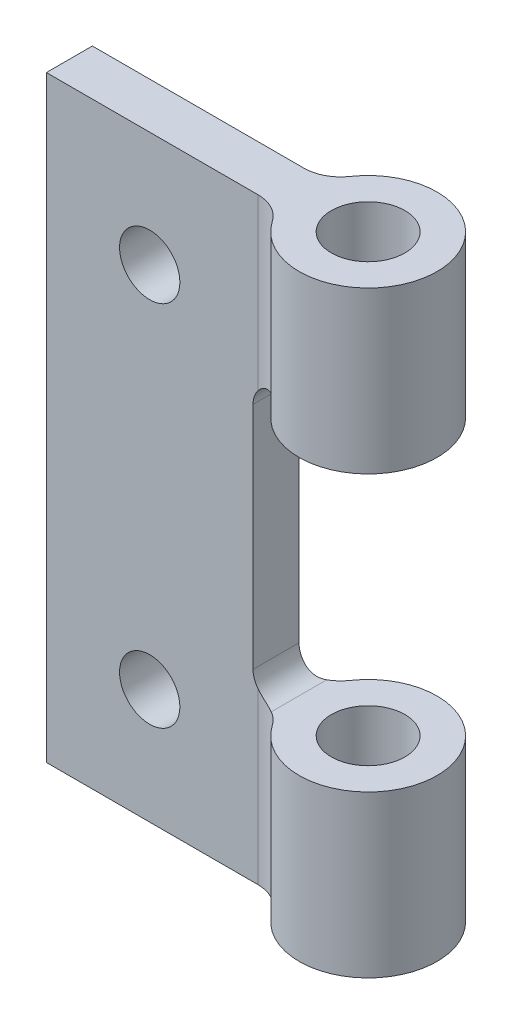
ISO-10303-21;
HEADER;
FILE_DESCRIPTION(('STEP AP214'),'2;1');
FILE_NAME('part.step','',(''),(''),'','','');
FILE_SCHEMA(('AUTOMOTIVE_DESIGN { 1 0 10303 214 1 1 1 1 }'));
ENDSEC;
DATA;
#1=APPLICATION_CONTEXT('core data for automotive mechanical design processes');
#2=APPLICATION_PROTOCOL_DEFINITION('international standard','automotive_design',2000,#1);
#3=PRODUCT_CONTEXT('',#1,'mechanical');
#4=PRODUCT('Part','Part','',(#3));
#5=PRODUCT_RELATED_PRODUCT_CATEGORY('part','',(#4));
#6=PRODUCT_DEFINITION_FORMATION('','',#4);
#7=PRODUCT_DEFINITION_CONTEXT('part definition',#1,'design');
#8=PRODUCT_DEFINITION('design','',#6,#7);
#9=PRODUCT_DEFINITION_SHAPE('','',#8);
#10=(LENGTH_UNIT() NAMED_UNIT(*) SI_UNIT(.MILLI.,.METRE.));
#11=(NAMED_UNIT(*) PLANE_ANGLE_UNIT() SI_UNIT($,.RADIAN.));
#12=(NAMED_UNIT(*) SI_UNIT($,.STERADIAN.) SOLID_ANGLE_UNIT());
#13=UNCERTAINTY_MEASURE_WITH_UNIT(LENGTH_MEASURE(1.E-05),#10,'distance_accuracy_value','');
#14=(GEOMETRIC_REPRESENTATION_CONTEXT(3) GLOBAL_UNCERTAINTY_ASSIGNED_CONTEXT((#13)) GLOBAL_UNIT_ASSIGNED_CONTEXT((#10,
#11,#12)) REPRESENTATION_CONTEXT('',''));
#15=CARTESIAN_POINT('',(0.,0.,0.));
#16=DIRECTION('',(0.,0.,1.));
#17=DIRECTION('',(1.,0.,0.));
#18=AXIS2_PLACEMENT_3D('',#15,#16,#17);
#19=CARTESIAN_POINT('',(12.6454507873427,11.1252,1.5875));
#20=DIRECTION('',(0.,-1.,0.));
#21=DIRECTION('',(0.,0.,-1.));
#22=AXIS2_PLACEMENT_3D('',#19,#20,#21);
#23=PLANE('',#22);
#24=CARTESIAN_POINT('',(20.6375,11.1252,0.));
#25=DIRECTION('',(0.,-1.,0.));
#26=DIRECTION('',(0.,0.,-1.));
#27=AXIS2_PLACEMENT_3D('',#24,#25,#26);
#28=CIRCLE('',#27,2.54);
#29=CARTESIAN_POINT('',(20.6375,11.1252,-2.54));
#30=VERTEX_POINT('',#29);
#31=EDGE_CURVE('E284',#30,#30,#28,.T.);
#32=ORIENTED_EDGE('',*,*,#31,.T.);
#33=EDGE_LOOP('',(#32));
#34=FACE_BOUND('',#33,.T.);
#35=DIRECTION('',(0.,0.,-1.));
#36=VECTOR('',#35,1.);
#37=CARTESIAN_POINT('',(15.8623,11.1252,1.5875));
#38=LINE('',#37,#36);
#39=CARTESIAN_POINT('',(15.8623,11.1252,1.91576956488696));
#40=VERTEX_POINT('',#39);
#41=CARTESIAN_POINT('',(15.8623,11.1252,-1.91576956488696));
#42=VERTEX_POINT('',#41);
#43=EDGE_CURVE('E58',#40,#42,#38,.T.);
#44=ORIENTED_EDGE('',*,*,#43,.F.);
#45=CARTESIAN_POINT('',(14.6133610573792,11.1252,4.1275));
#46=DIRECTION('',(0.,-1.,0.));
#47=DIRECTION('',(0.,0.,-1.));
#48=AXIS2_PLACEMENT_3D('',#45,#46,#47);
#49=CIRCLE('',#48,2.54);
#50=CARTESIAN_POINT('',(16.7087137330734,11.1252,2.69184782608696));
#51=VERTEX_POINT('',#50);
#52=EDGE_CURVE('E253',#40,#51,#49,.T.);
#53=ORIENTED_EDGE('',*,*,#52,.T.);
#54=CARTESIAN_POINT('',(20.6375,11.1252,0.));
#55=DIRECTION('',(0.,1.,0.));
#56=DIRECTION('',(0.,0.,1.));
#57=AXIS2_PLACEMENT_3D('',#54,#55,#56);
#58=CIRCLE('',#57,4.7625);
#59=CARTESIAN_POINT('',(16.7087137330734,11.1252,-2.69184782608696));
#60=VERTEX_POINT('',#59);
#61=EDGE_CURVE('E286',#51,#60,#58,.T.);
#62=ORIENTED_EDGE('',*,*,#61,.T.);
#63=CARTESIAN_POINT('',(14.6133610573792,11.1252,-4.1275));
#64=DIRECTION('',(0.,-1.,0.));
#65=DIRECTION('',(0.,0.,-1.));
#66=AXIS2_PLACEMENT_3D('',#63,#64,#65);
#67=CIRCLE('',#66,2.54);
#68=EDGE_CURVE('E214',#60,#42,#67,.T.);
#69=ORIENTED_EDGE('',*,*,#68,.T.);
#70=EDGE_LOOP('',(#44,#53,#62,#69));
#71=FACE_BOUND('',#70,.T.);
#72=ADVANCED_FACE('F32',(#34,#71),#23,.F.);
#73=CARTESIAN_POINT('',(12.6454507873427,30.1498,1.5875));
#74=DIRECTION('',(0.,1.,0.));
#75=DIRECTION('',(-1.,0.,0.));
#76=AXIS2_PLACEMENT_3D('',#73,#74,#75);
#77=PLANE('',#76);
#78=CARTESIAN_POINT('',(20.6375,30.1498,0.));
#79=DIRECTION('',(0.,1.,0.));
#80=DIRECTION('',(-1.,0.,0.));
#81=AXIS2_PLACEMENT_3D('',#78,#79,#80);
#82=CIRCLE('',#81,2.54);
#83=CARTESIAN_POINT('',(18.0975,30.1498,0.));
#84=VERTEX_POINT('',#83);
#85=EDGE_CURVE('E287',#84,#84,#82,.T.);
#86=ORIENTED_EDGE('',*,*,#85,.T.);
#87=EDGE_LOOP('',(#86));
#88=FACE_BOUND('',#87,.T.);
#89=DIRECTION('',(0.,0.,-1.));
#90=VECTOR('',#89,1.);
#91=CARTESIAN_POINT('',(15.8623,30.1498,1.5875));
#92=LINE('',#91,#90);
#93=CARTESIAN_POINT('',(15.8623,30.1498,1.91576956488696));
#94=VERTEX_POINT('',#93);
#95=CARTESIAN_POINT('',(15.8623,30.1498,-1.91576956488696));
#96=VERTEX_POINT('',#95);
#97=EDGE_CURVE('E50',#94,#96,#92,.T.);
#98=ORIENTED_EDGE('',*,*,#97,.T.);
#99=CARTESIAN_POINT('',(14.6133610573792,30.1498,-4.1275));
#100=DIRECTION('',(0.,1.,0.));
#101=DIRECTION('',(-1.,0.,0.));
#102=AXIS2_PLACEMENT_3D('',#99,#100,#101);
#103=CIRCLE('',#102,2.54);
#104=CARTESIAN_POINT('',(16.7087137330734,30.1498,-2.69184782608696));
#105=VERTEX_POINT('',#104);
#106=EDGE_CURVE('E314',#96,#105,#103,.T.);
#107=ORIENTED_EDGE('',*,*,#106,.T.);
#108=CARTESIAN_POINT('',(20.6375,30.1498,0.));
#109=DIRECTION('',(0.,1.,0.));
#110=DIRECTION('',(-1.,0.,0.));
#111=AXIS2_PLACEMENT_3D('',#108,#109,#110);
#112=CIRCLE('',#111,4.7625);
#113=CARTESIAN_POINT('',(16.7087137330734,30.1498,2.69184782608696));
#114=VERTEX_POINT('',#113);
#115=EDGE_CURVE('E174',#114,#105,#112,.T.);
#116=ORIENTED_EDGE('',*,*,#115,.F.);
#117=CARTESIAN_POINT('',(14.6133610573792,30.1498,4.1275));
#118=DIRECTION('',(0.,1.,0.));
#119=DIRECTION('',(-1.,0.,0.));
#120=AXIS2_PLACEMENT_3D('',#117,#118,#119);
#121=CIRCLE('',#120,2.54);
#122=EDGE_CURVE('E257',#114,#94,#121,.T.);
#123=ORIENTED_EDGE('',*,*,#122,.T.);
#124=EDGE_LOOP('',(#98,#107,#116,#123));
#125=FACE_BOUND('',#124,.T.);
#126=ADVANCED_FACE('F267',(#88,#125),#77,.F.);
#127=CARTESIAN_POINT('',(12.6454507873427,41.275,1.5875));
#128=DIRECTION('',(0.,-1.,0.));
#129=DIRECTION('',(1.,0.,0.));
#130=AXIS2_PLACEMENT_3D('',#127,#128,#129);
#131=PLANE('',#130);
#132=CARTESIAN_POINT('',(20.6375,41.275,0.));
#133=DIRECTION('',(0.,1.,0.));
#134=DIRECTION('',(-1.,0.,0.));
#135=AXIS2_PLACEMENT_3D('',#132,#133,#134);
#136=CIRCLE('',#135,2.54);
#137=CARTESIAN_POINT('',(18.0975,41.275,0.));
#138=VERTEX_POINT('',#137);
#139=EDGE_CURVE('E356',#138,#138,#136,.T.);
#140=ORIENTED_EDGE('',*,*,#139,.F.);
#141=EDGE_LOOP('',(#140));
#142=FACE_BOUND('',#141,.T.);
#143=DIRECTION('',(-1.,0.,0.));
#144=VECTOR('',#143,1.);
#145=CARTESIAN_POINT('',(12.6454507873427,41.275,1.5875));
#146=LINE('',#145,#144);
#147=CARTESIAN_POINT('',(14.6133610573792,41.275,1.5875));
#148=VERTEX_POINT('',#147);
#149=CARTESIAN_POINT('',(0.,41.275,1.5875));
#150=VERTEX_POINT('',#149);
#151=EDGE_CURVE('E162',#148,#150,#146,.T.);
#152=ORIENTED_EDGE('',*,*,#151,.F.);
#153=CARTESIAN_POINT('',(14.6133610573792,41.275,4.1275));
#154=DIRECTION('',(0.,-1.,0.));
#155=DIRECTION('',(1.,0.,0.));
#156=AXIS2_PLACEMENT_3D('',#153,#154,#155);
#157=CIRCLE('',#156,2.54);
#158=CARTESIAN_POINT('',(16.7087137330734,41.275,2.69184782608696));
#159=VERTEX_POINT('',#158);
#160=EDGE_CURVE('E12',#148,#159,#157,.T.);
#161=ORIENTED_EDGE('',*,*,#160,.T.);
#162=CARTESIAN_POINT('',(20.6375,41.275,0.));
#163=DIRECTION('',(0.,1.,0.));
#164=DIRECTION('',(-1.,0.,0.));
#165=AXIS2_PLACEMENT_3D('',#162,#163,#164);
#166=CIRCLE('',#165,4.7625);
#167=CARTESIAN_POINT('',(16.7087137330734,41.275,-2.69184782608696));
#168=VERTEX_POINT('',#167);
#169=EDGE_CURVE('E298',#159,#168,#166,.T.);
#170=ORIENTED_EDGE('',*,*,#169,.T.);
#171=CARTESIAN_POINT('',(14.6133610573792,41.275,-4.1275));
#172=DIRECTION('',(0.,-1.,0.));
#173=DIRECTION('',(1.,0.,0.));
#174=AXIS2_PLACEMENT_3D('',#171,#172,#173);
#175=CIRCLE('',#174,2.54);
#176=CARTESIAN_POINT('',(14.6133610573792,41.275,-1.5875));
#177=VERTEX_POINT('',#176);
#178=EDGE_CURVE('E306',#168,#177,#175,.T.);
#179=ORIENTED_EDGE('',*,*,#178,.T.);
#180=DIRECTION('',(-1.,0.,0.));
#181=VECTOR('',#180,1.);
#182=CARTESIAN_POINT('',(12.6454507873427,41.275,-1.5875));
#183=LINE('',#182,#181);
#184=CARTESIAN_POINT('',(0.,41.275,-1.5875));
#185=VERTEX_POINT('',#184);
#186=EDGE_CURVE('E179',#177,#185,#183,.T.);
#187=ORIENTED_EDGE('',*,*,#186,.T.);
#188=DIRECTION('',(0.,0.,-1.));
#189=VECTOR('',#188,1.);
#190=CARTESIAN_POINT('',(0.,41.275,1.5875));
#191=LINE('',#190,#189);
#192=EDGE_CURVE('E187',#150,#185,#191,.T.);
#193=ORIENTED_EDGE('',*,*,#192,.F.);
#194=EDGE_LOOP('',(#152,#161,#170,#179,#187,#193));
#195=FACE_BOUND('',#194,.T.);
#196=ADVANCED_FACE('F280',(#142,#195),#131,.F.);
#197=CARTESIAN_POINT('',(12.6454507873427,0.,1.5875));
#198=DIRECTION('',(0.,1.,0.));
#199=DIRECTION('',(0.,0.,1.));
#200=AXIS2_PLACEMENT_3D('',#197,#198,#199);
#201=PLANE('',#200);
#202=CARTESIAN_POINT('',(20.6375,0.,0.));
#203=DIRECTION('',(0.,1.,0.));
#204=DIRECTION('',(-1.,0.,0.));
#205=AXIS2_PLACEMENT_3D('',#202,#203,#204);
#206=CIRCLE('',#205,2.54);
#207=CARTESIAN_POINT('',(18.0975,0.,0.));
#208=VERTEX_POINT('',#207);
#209=EDGE_CURVE('E293',#208,#208,#206,.T.);
#210=ORIENTED_EDGE('',*,*,#209,.T.);
#211=EDGE_LOOP('',(#210));
#212=FACE_BOUND('',#211,.T.);
#213=DIRECTION('',(1.,0.,0.));
#214=VECTOR('',#213,1.);
#215=CARTESIAN_POINT('',(12.6454507873427,0.,-1.5875));
#216=LINE('',#215,#214);
#217=CARTESIAN_POINT('',(0.,0.,-1.5875));
#218=VERTEX_POINT('',#217);
#219=CARTESIAN_POINT('',(14.6133610573792,0.,-1.5875));
#220=VERTEX_POINT('',#219);
#221=EDGE_CURVE('E146',#218,#220,#216,.T.);
#222=ORIENTED_EDGE('',*,*,#221,.T.);
#223=CARTESIAN_POINT('',(14.6133610573792,0.,-4.1275));
#224=DIRECTION('',(0.,1.,0.));
#225=DIRECTION('',(0.,0.,1.));
#226=AXIS2_PLACEMENT_3D('',#223,#224,#225);
#227=CIRCLE('',#226,2.54);
#228=CARTESIAN_POINT('',(16.7087137330734,0.,-2.69184782608696));
#229=VERTEX_POINT('',#228);
#230=EDGE_CURVE('E212',#220,#229,#227,.T.);
#231=ORIENTED_EDGE('',*,*,#230,.T.);
#232=CARTESIAN_POINT('',(20.6375,0.,0.));
#233=DIRECTION('',(0.,1.,0.));
#234=DIRECTION('',(0.,0.,1.));
#235=AXIS2_PLACEMENT_3D('',#232,#233,#234);
#236=CIRCLE('',#235,4.7625);
#237=CARTESIAN_POINT('',(16.7087137330734,0.,2.69184782608696));
#238=VERTEX_POINT('',#237);
#239=EDGE_CURVE('E290',#238,#229,#236,.T.);
#240=ORIENTED_EDGE('',*,*,#239,.F.);
#241=CARTESIAN_POINT('',(14.6133610573792,0.,4.1275));
#242=DIRECTION('',(0.,1.,0.));
#243=DIRECTION('',(0.,0.,1.));
#244=AXIS2_PLACEMENT_3D('',#241,#242,#243);
#245=CIRCLE('',#244,2.54);
#246=CARTESIAN_POINT('',(14.6133610573792,0.,1.5875));
#247=VERTEX_POINT('',#246);
#248=EDGE_CURVE('E254',#238,#247,#245,.T.);
#249=ORIENTED_EDGE('',*,*,#248,.T.);
#250=DIRECTION('',(1.,0.,0.));
#251=VECTOR('',#250,1.);
#252=CARTESIAN_POINT('',(12.6454507873427,0.,1.5875));
#253=LINE('',#252,#251);
#254=CARTESIAN_POINT('',(0.,0.,1.5875));
#255=VERTEX_POINT('',#254);
#256=EDGE_CURVE('E169',#255,#247,#253,.T.);
#257=ORIENTED_EDGE('',*,*,#256,.F.);
#258=DIRECTION('',(0.,0.,-1.));
#259=VECTOR('',#258,1.);
#260=CARTESIAN_POINT('',(0.,0.,1.5875));
#261=LINE('',#260,#259);
#262=EDGE_CURVE('E171',#255,#218,#261,.T.);
#263=ORIENTED_EDGE('',*,*,#262,.T.);
#264=EDGE_LOOP('',(#222,#231,#240,#249,#257,#263));
#265=FACE_BOUND('',#264,.T.);
#266=ADVANCED_FACE('F343',(#212,#265),#201,.F.);
#267=CARTESIAN_POINT('',(12.6454507873427,-17.4466614917595,1.5875));
#268=DIRECTION('',(0.,0.,1.));
#269=DIRECTION('',(1.,0.,0.));
#270=AXIS2_PLACEMENT_3D('',#267,#268,#269);
#271=PLANE('',#270);
#272=CARTESIAN_POINT('',(7.1374,7.9375,1.5875));
#273=DIRECTION('',(0.,0.,1.));
#274=DIRECTION('',(-1.,0.,0.));
#275=AXIS2_PLACEMENT_3D('',#272,#273,#274);
#276=CIRCLE('',#275,2.08299863257851);
#277=CARTESIAN_POINT('',(5.05440136742149,7.9375,1.5875));
#278=VERTEX_POINT('',#277);
#279=EDGE_CURVE('E366',#278,#278,#276,.T.);
#280=ORIENTED_EDGE('',*,*,#279,.F.);
#281=EDGE_LOOP('',(#280));
#282=FACE_BOUND('',#281,.T.);
#283=CARTESIAN_POINT('',(7.1374,33.3375,1.5875));
#284=DIRECTION('',(0.,0.,1.));
#285=DIRECTION('',(1.,0.,0.));
#286=AXIS2_PLACEMENT_3D('',#283,#284,#285);
#287=CIRCLE('',#286,2.08299863257851);
#288=CARTESIAN_POINT('',(9.22039863257851,33.3375,1.5875));
#289=VERTEX_POINT('',#288);
#290=EDGE_CURVE('E362',#289,#289,#287,.T.);
#291=ORIENTED_EDGE('',*,*,#290,.F.);
#292=EDGE_LOOP('',(#291));
#293=FACE_BOUND('',#292,.T.);
#294=ORIENTED_EDGE('',*,*,#256,.T.);
#295=DIRECTION('',(0.,-1.,0.));
#296=VECTOR('',#295,1.);
#297=CARTESIAN_POINT('',(14.6133610573792,11.1252,1.5875));
#298=LINE('',#297,#296);
#299=CARTESIAN_POINT('',(14.6133610573792,11.7327470584741,1.5875));
#300=VERTEX_POINT('',#299);
#301=EDGE_CURVE('E143',#247,#300,#298,.F.);
#302=ORIENTED_EDGE('',*,*,#301,.T.);
#303=CARTESIAN_POINT('',(15.8623,12.7127,1.5875));
#304=DIRECTION('',(0.,0.,1.));
#305=DIRECTION('',(1.,0.,0.));
#306=AXIS2_PLACEMENT_3D('',#303,#304,#305);
#307=CIRCLE('',#306,1.5875);
#308=CARTESIAN_POINT('',(14.2748,12.7127,1.5875));
#309=VERTEX_POINT('',#308);
#310=EDGE_CURVE('E134',#300,#309,#307,.F.);
#311=ORIENTED_EDGE('',*,*,#310,.T.);
#312=DIRECTION('',(0.,1.,0.));
#313=VECTOR('',#312,1.);
#314=CARTESIAN_POINT('',(14.2748,-17.4466614917595,1.5875));
#315=LINE('',#314,#313);
#316=CARTESIAN_POINT('',(14.2748,28.5623,1.5875));
#317=VERTEX_POINT('',#316);
#318=EDGE_CURVE('E140',#309,#317,#315,.T.);
#319=ORIENTED_EDGE('',*,*,#318,.T.);
#320=CARTESIAN_POINT('',(15.8623,28.5623,1.5875));
#321=DIRECTION('',(0.,0.,1.));
#322=DIRECTION('',(1.,0.,0.));
#323=AXIS2_PLACEMENT_3D('',#320,#321,#322);
#324=CIRCLE('',#323,1.5875);
#325=CARTESIAN_POINT('',(14.6133610573792,29.5422529415259,1.5875));
#326=VERTEX_POINT('',#325);
#327=EDGE_CURVE('E160',#317,#326,#324,.F.);
#328=ORIENTED_EDGE('',*,*,#327,.T.);
#329=DIRECTION('',(0.,-1.,0.));
#330=VECTOR('',#329,1.);
#331=CARTESIAN_POINT('',(14.6133610573792,41.275,1.5875));
#332=LINE('',#331,#330);
#333=EDGE_CURVE('E209',#326,#148,#332,.F.);
#334=ORIENTED_EDGE('',*,*,#333,.T.);
#335=ORIENTED_EDGE('',*,*,#151,.T.);
#336=DIRECTION('',(0.,-1.,0.));
#337=VECTOR('',#336,1.);
#338=CARTESIAN_POINT('',(0.,-17.4466614917595,1.5875));
#339=LINE('',#338,#337);
#340=EDGE_CURVE('E167',#150,#255,#339,.T.);
#341=ORIENTED_EDGE('',*,*,#340,.T.);
#342=EDGE_LOOP('',(#294,#302,#311,#319,#328,#334,#335,#341));
#343=FACE_BOUND('',#342,.T.);
#344=ADVANCED_FACE('F137',(#282,#293,#343),#271,.T.);
#345=CARTESIAN_POINT('',(12.6454507873427,-17.4466614917595,-1.5875));
#346=DIRECTION('',(0.,0.,1.));
#347=DIRECTION('',(1.,0.,0.));
#348=AXIS2_PLACEMENT_3D('',#345,#346,#347);
#349=PLANE('',#348);
#350=CARTESIAN_POINT('',(7.1374,7.9375,-1.5875));
#351=DIRECTION('',(0.,0.,1.));
#352=DIRECTION('',(1.,0.,0.));
#353=AXIS2_PLACEMENT_3D('',#350,#351,#352);
#354=CIRCLE('',#353,2.08299863257851);
#355=CARTESIAN_POINT('',(9.22039863257851,7.9375,-1.5875));
#356=VERTEX_POINT('',#355);
#357=EDGE_CURVE('E37',#356,#356,#354,.T.);
#358=ORIENTED_EDGE('',*,*,#357,.T.);
#359=EDGE_LOOP('',(#358));
#360=FACE_BOUND('',#359,.T.);
#361=CARTESIAN_POINT('',(7.1374,33.3375,-1.5875));
#362=DIRECTION('',(0.,0.,1.));
#363=DIRECTION('',(1.,0.,0.));
#364=AXIS2_PLACEMENT_3D('',#361,#362,#363);
#365=CIRCLE('',#364,2.08299863257851);
#366=CARTESIAN_POINT('',(9.22039863257851,33.3375,-1.5875));
#367=VERTEX_POINT('',#366);
#368=EDGE_CURVE('E358',#367,#367,#365,.T.);
#369=ORIENTED_EDGE('',*,*,#368,.T.);
#370=EDGE_LOOP('',(#369));
#371=FACE_BOUND('',#370,.T.);
#372=CARTESIAN_POINT('',(15.8623,12.7127,-1.5875));
#373=DIRECTION('',(0.,0.,1.));
#374=DIRECTION('',(1.,0.,0.));
#375=AXIS2_PLACEMENT_3D('',#372,#373,#374);
#376=CIRCLE('',#375,1.5875);
#377=CARTESIAN_POINT('',(14.6133610573792,11.7327470584741,-1.5875));
#378=VERTEX_POINT('',#377);
#379=CARTESIAN_POINT('',(14.2748,12.7127,-1.5875));
#380=VERTEX_POINT('',#379);
#381=EDGE_CURVE('E152',#378,#380,#376,.F.);
#382=ORIENTED_EDGE('',*,*,#381,.F.);
#383=DIRECTION('',(0.,1.,0.));
#384=VECTOR('',#383,1.);
#385=CARTESIAN_POINT('',(14.6133610573792,-17.4466614917595,-1.5875));
#386=LINE('',#385,#384);
#387=EDGE_CURVE('E196',#378,#220,#386,.F.);
#388=ORIENTED_EDGE('',*,*,#387,.T.);
#389=ORIENTED_EDGE('',*,*,#221,.F.);
#390=DIRECTION('',(0.,-1.,0.));
#391=VECTOR('',#390,1.);
#392=CARTESIAN_POINT('',(0.,-17.4466614917595,-1.5875));
#393=LINE('',#392,#391);
#394=EDGE_CURVE('E181',#185,#218,#393,.T.);
#395=ORIENTED_EDGE('',*,*,#394,.F.);
#396=ORIENTED_EDGE('',*,*,#186,.F.);
#397=DIRECTION('',(0.,1.,0.));
#398=VECTOR('',#397,1.);
#399=CARTESIAN_POINT('',(14.6133610573792,-17.4466614917595,-1.5875));
#400=LINE('',#399,#398);
#401=CARTESIAN_POINT('',(14.6133610573792,29.5422529415259,-1.5875));
#402=VERTEX_POINT('',#401);
#403=EDGE_CURVE('E193',#177,#402,#400,.F.);
#404=ORIENTED_EDGE('',*,*,#403,.T.);
#405=CARTESIAN_POINT('',(15.8623,28.5623,-1.5875));
#406=DIRECTION('',(0.,0.,1.));
#407=DIRECTION('',(1.,0.,0.));
#408=AXIS2_PLACEMENT_3D('',#405,#406,#407);
#409=CIRCLE('',#408,1.5875);
#410=CARTESIAN_POINT('',(14.2748,28.5623,-1.5875));
#411=VERTEX_POINT('',#410);
#412=EDGE_CURVE('E176',#411,#402,#409,.F.);
#413=ORIENTED_EDGE('',*,*,#412,.F.);
#414=DIRECTION('',(0.,1.,0.));
#415=VECTOR('',#414,1.);
#416=CARTESIAN_POINT('',(14.2748,-17.4466614917595,-1.5875));
#417=LINE('',#416,#415);
#418=EDGE_CURVE('E173',#380,#411,#417,.T.);
#419=ORIENTED_EDGE('',*,*,#418,.F.);
#420=EDGE_LOOP('',(#382,#388,#389,#395,#396,#404,#413,#419));
#421=FACE_BOUND('',#420,.T.);
#422=ADVANCED_FACE('F274',(#360,#371,#421),#349,.F.);
#423=CARTESIAN_POINT('',(15.8623,12.7127,1.5875));
#424=DIRECTION('',(0.,0.,-1.));
#425=DIRECTION('',(-1.,0.,0.));
#426=AXIS2_PLACEMENT_3D('',#423,#424,#425);
#427=CYLINDRICAL_SURFACE('',#426,1.5875);
#428=ORIENTED_EDGE('',*,*,#43,.T.);
#429=CARTESIAN_POINT('',(15.8623,11.1252,-1.91576956488696));
#430=CARTESIAN_POINT('',(15.8265951776504,11.1251955213151,-1.89559970741005));
#431=CARTESIAN_POINT('',(15.7903868274591,11.1264048193063,-1.87630143243275));
#432=CARTESIAN_POINT('',(15.7172069517582,11.1314198777596,-1.83953295685536));
#433=CARTESIAN_POINT('',(15.6802350301863,11.1352270202751,-1.82206373502033));
#434=CARTESIAN_POINT('',(15.6059129628617,11.1455927450596,-1.78910540447404));
#435=CARTESIAN_POINT('',(15.568564139273,11.1521437204145,-1.773610974637));
#436=CARTESIAN_POINT('',(15.493726819011,11.1681038305044,-1.7446087877968));
#437=CARTESIAN_POINT('',(15.4562383531764,11.1775123673103,-1.73110061605677));
#438=CARTESIAN_POINT('',(15.3437250597455,11.210259034427,-1.69348960387166));
#439=CARTESIAN_POINT('',(15.2689116429615,11.2380841580082,-1.67241386122466));
#440=CARTESIAN_POINT('',(15.1229763429828,11.305562262104,-1.63801451889454));
#441=CARTESIAN_POINT('',(15.0518553153879,11.345217969765,-1.62469270871359));
#442=CARTESIAN_POINT('',(14.9140048350184,11.4368009174207,-1.60436671992133));
#443=CARTESIAN_POINT('',(14.8474546544042,11.4890413288289,-1.5975503423185));
#444=CARTESIAN_POINT('',(14.7543611867407,11.5749697027458,-1.59122347768535));
#445=CARTESIAN_POINT('',(14.7244065084232,11.6049316164343,-1.58976500252249));
#446=CARTESIAN_POINT('',(14.6669808706698,11.6671584039763,-1.58790446264136));
#447=CARTESIAN_POINT('',(14.6395089602695,11.6994223875311,-1.587501991776));
#448=CARTESIAN_POINT('',(14.6133610573792,11.7327470584741,-1.5875));
#449=B_SPLINE_CURVE_WITH_KNOTS('',3,(#429,#430,#431,#432,#433,#434,#435,#436,#437,#438,#439,
#440,#441,#442,#443,#444,#445,#446,#447,#448),.UNSPECIFIED.,.F.,.F.,(4,2,2,2,2,2,2,2,2,4),(0.,
0.123007800977245,0.246081093183128,0.368815416075154,0.49152407515515,0.737785438551645,
0.984103613209903,1.23733484101973,1.36438632123508,1.49138892934174),.UNSPECIFIED.);
#450=EDGE_CURVE('E216',#42,#378,#449,.T.);
#451=ORIENTED_EDGE('',*,*,#450,.T.);
#452=ORIENTED_EDGE('',*,*,#381,.T.);
#453=DIRECTION('',(0.,0.,-1.));
#454=VECTOR('',#453,1.);
#455=CARTESIAN_POINT('',(14.2748,12.7127,1.5875));
#456=LINE('',#455,#454);
#457=EDGE_CURVE('E149',#309,#380,#456,.T.);
#458=ORIENTED_EDGE('',*,*,#457,.F.);
#459=ORIENTED_EDGE('',*,*,#310,.F.);
#460=CARTESIAN_POINT('',(14.6133610573792,11.7327470584741,1.5875));
#461=CARTESIAN_POINT('',(14.638722208525,11.7004247562579,1.58750166224726));
#462=CARTESIAN_POINT('',(14.6653295445861,11.6690998037465,1.58788039700718));
#463=CARTESIAN_POINT('',(14.7208837913928,11.6086100856323,1.58962390560149));
#464=CARTESIAN_POINT('',(14.7498314623971,11.5794460279414,1.59098900100792));
#465=CARTESIAN_POINT('',(14.8397505117637,11.4956411666086,1.59689987211995));
#466=CARTESIAN_POINT('',(14.9039510981518,11.4444929101356,1.60325849921921));
#467=CARTESIAN_POINT('',(15.0390171091661,11.3529015149999,1.62248791939939));
#468=CARTESIAN_POINT('',(15.1099054559306,11.3124971507785,1.63538182454564));
#469=CARTESIAN_POINT('',(15.2555624420857,11.2435152955054,1.66889519314664));
#470=CARTESIAN_POINT('',(15.3303305639818,11.2149362317043,1.68951362855352));
#471=CARTESIAN_POINT('',(15.4439659660867,11.1807792188962,1.72680158271534));
#472=CARTESIAN_POINT('',(15.4825602325651,11.170780951195,1.74049366984123));
#473=CARTESIAN_POINT('',(15.5596332031856,11.1538213644077,1.76998697825242));
#474=CARTESIAN_POINT('',(15.598111875148,11.1468608249309,1.785788739612));
#475=CARTESIAN_POINT('',(15.6747010396216,11.1358471047953,1.81948949991303));
#476=CARTESIAN_POINT('',(15.7128099979343,11.1318031157287,1.83739492422249));
#477=CARTESIAN_POINT('',(15.7882240474963,11.1264778048108,1.87514921679277));
#478=CARTESIAN_POINT('',(15.825529602222,11.1251948454509,1.8949969258182));
#479=CARTESIAN_POINT('',(15.8623,11.1252,1.91576956488696));
#480=B_SPLINE_CURVE_WITH_KNOTS('',3,(#460,#461,#462,#463,#464,#465,#466,#467,#468,#469,#470,
#471,#472,#473,#474,#475,#476,#477,#478,#479),.UNSPECIFIED.,.F.,.F.,(4,2,2,2,2,2,2,2,2,4),(0.,
0.123186892813303,0.246413964991272,0.492133651872159,0.73872845576985,0.98529045233193,
1.11161641674464,1.23797478269773,1.36472965090224,1.49140932271461),.UNSPECIFIED.);
#481=EDGE_CURVE('E247',#300,#40,#480,.T.);
#482=ORIENTED_EDGE('',*,*,#481,.T.);
#483=EDGE_LOOP('',(#428,#451,#452,#458,#459,#482));
#484=FACE_BOUND('',#483,.T.);
#485=ADVANCED_FACE('F150',(#484),#427,.F.);
#486=CARTESIAN_POINT('',(14.2748,-17.4466614917595,1.5875));
#487=DIRECTION('',(-1.,0.,0.));
#488=DIRECTION('',(0.,0.,1.));
#489=AXIS2_PLACEMENT_3D('',#486,#487,#488);
#490=PLANE('',#489);
#491=ORIENTED_EDGE('',*,*,#418,.T.);
#492=DIRECTION('',(0.,0.,-1.));
#493=VECTOR('',#492,1.);
#494=CARTESIAN_POINT('',(14.2748,28.5623,1.5875));
#495=LINE('',#494,#493);
#496=EDGE_CURVE('E155',#317,#411,#495,.T.);
#497=ORIENTED_EDGE('',*,*,#496,.F.);
#498=ORIENTED_EDGE('',*,*,#318,.F.);
#499=ORIENTED_EDGE('',*,*,#457,.T.);
#500=EDGE_LOOP('',(#491,#497,#498,#499));
#501=FACE_BOUND('',#500,.T.);
#502=ADVANCED_FACE('F157',(#501),#490,.F.);
#503=CARTESIAN_POINT('',(15.8623,28.5623,1.5875));
#504=DIRECTION('',(0.,0.,-1.));
#505=DIRECTION('',(-1.,0.,0.));
#506=AXIS2_PLACEMENT_3D('',#503,#504,#505);
#507=CYLINDRICAL_SURFACE('',#506,1.5875);
#508=ORIENTED_EDGE('',*,*,#412,.T.);
#509=CARTESIAN_POINT('',(14.6133610573792,29.5422529415259,-1.5875));
#510=CARTESIAN_POINT('',(14.638722208525,29.5745752437421,-1.58750166224726));
#511=CARTESIAN_POINT('',(14.6653295445861,29.6059001962535,-1.58788039700718));
#512=CARTESIAN_POINT('',(14.7208837913928,29.6663899143677,-1.58962390560149));
#513=CARTESIAN_POINT('',(14.7498314623971,29.6955539720586,-1.59098900100792));
#514=CARTESIAN_POINT('',(14.8397505117637,29.7793588333914,-1.59689987211995));
#515=CARTESIAN_POINT('',(14.9039510981518,29.8305070898644,-1.60325849921921));
#516=CARTESIAN_POINT('',(15.0390171091661,29.9220984850001,-1.62248791939939));
#517=CARTESIAN_POINT('',(15.1099054559306,29.9625028492215,-1.63538182454564));
#518=CARTESIAN_POINT('',(15.2555624420857,30.0314847044946,-1.66889519314664));
#519=CARTESIAN_POINT('',(15.3303305639818,30.0600637682957,-1.68951362855352));
#520=CARTESIAN_POINT('',(15.4439659660867,30.0942207811038,-1.72680158271534));
#521=CARTESIAN_POINT('',(15.4825602325651,30.104219048805,-1.74049366984123));
#522=CARTESIAN_POINT('',(15.5596332031856,30.1211786355923,-1.76998697825242));
#523=CARTESIAN_POINT('',(15.598111875148,30.1281391750691,-1.785788739612));
#524=CARTESIAN_POINT('',(15.6747010396216,30.1391528952047,-1.81948949991303));
#525=CARTESIAN_POINT('',(15.7128099979343,30.1431968842713,-1.83739492422249));
#526=CARTESIAN_POINT('',(15.7882240474963,30.1485221951892,-1.87514921679277));
#527=CARTESIAN_POINT('',(15.825529602222,30.1498051545491,-1.8949969258182));
#528=CARTESIAN_POINT('',(15.8623,30.1498,-1.91576956488696));
#529=B_SPLINE_CURVE_WITH_KNOTS('',3,(#509,#510,#511,#512,#513,#514,#515,#516,#517,#518,#519,
#520,#521,#522,#523,#524,#525,#526,#527,#528),.UNSPECIFIED.,.F.,.F.,(4,2,2,2,2,2,2,2,2,4),(0.,
0.123186892813303,0.246413964991274,0.49213365187216,0.73872845576985,0.985290452331933,
1.11161641674464,1.23797478269774,1.36472965090225,1.49140932271462),.UNSPECIFIED.);
#530=EDGE_CURVE('E223',#402,#96,#529,.T.);
#531=ORIENTED_EDGE('',*,*,#530,.T.);
#532=ORIENTED_EDGE('',*,*,#97,.F.);
#533=CARTESIAN_POINT('',(15.8623,30.1498,1.91576956488696));
#534=CARTESIAN_POINT('',(15.8265951776504,30.1498044786849,1.89559970741005));
#535=CARTESIAN_POINT('',(15.7903868274591,30.1485951806937,1.87630143243275));
#536=CARTESIAN_POINT('',(15.7172069517582,30.1435801222404,1.83953295685536));
#537=CARTESIAN_POINT('',(15.6802350301863,30.1397729797249,1.82206373502033));
#538=CARTESIAN_POINT('',(15.6059129628617,30.1294072549404,1.78910540447404));
#539=CARTESIAN_POINT('',(15.568564139273,30.1228562795855,1.773610974637));
#540=CARTESIAN_POINT('',(15.493726819011,30.1068961694956,1.74460878779681));
#541=CARTESIAN_POINT('',(15.4562383531764,30.0974876326897,1.73110061605677));
#542=CARTESIAN_POINT('',(15.3437250597455,30.064740965573,1.69348960387166));
#543=CARTESIAN_POINT('',(15.2689116429615,30.0369158419918,1.67241386122466));
#544=CARTESIAN_POINT('',(15.1229763429828,29.969437737896,1.63801451889454));
#545=CARTESIAN_POINT('',(15.0518553153879,29.929782030235,1.62469270871359));
#546=CARTESIAN_POINT('',(14.9140048350184,29.8381990825793,1.60436671992134));
#547=CARTESIAN_POINT('',(14.8474546544042,29.7859586711711,1.5975503423185));
#548=CARTESIAN_POINT('',(14.7543611867407,29.7000302972542,1.59122347768535));
#549=CARTESIAN_POINT('',(14.7244065084232,29.6700683835657,1.58976500252249));
#550=CARTESIAN_POINT('',(14.6669808706698,29.6078415960237,1.58790446264136));
#551=CARTESIAN_POINT('',(14.6395089602695,29.5755776124689,1.587501991776));
#552=CARTESIAN_POINT('',(14.6133610573792,29.5422529415259,1.5875));
#553=B_SPLINE_CURVE_WITH_KNOTS('',3,(#533,#534,#535,#536,#537,#538,#539,#540,#541,#542,#543,
#544,#545,#546,#547,#548,#549,#550,#551,#552),.UNSPECIFIED.,.F.,.F.,(4,2,2,2,2,2,2,2,2,4),(0.,
0.123007800977245,0.246081093183128,0.368815416075154,0.491524075155148,0.737785438551644,
0.984103613209902,1.23733484101973,1.36438632123508,1.49138892934175),.UNSPECIFIED.);
#554=EDGE_CURVE('E42',#94,#326,#553,.T.);
#555=ORIENTED_EDGE('',*,*,#554,.T.);
#556=ORIENTED_EDGE('',*,*,#327,.F.);
#557=ORIENTED_EDGE('',*,*,#496,.T.);
#558=EDGE_LOOP('',(#508,#531,#532,#555,#556,#557));
#559=FACE_BOUND('',#558,.T.);
#560=ADVANCED_FACE('F262',(#559),#507,.F.);
#561=CARTESIAN_POINT('',(0.,-17.4466614917595,1.5875));
#562=DIRECTION('',(1.,0.,0.));
#563=DIRECTION('',(0.,1.,0.));
#564=AXIS2_PLACEMENT_3D('',#561,#562,#563);
#565=PLANE('',#564);
#566=ORIENTED_EDGE('',*,*,#394,.T.);
#567=ORIENTED_EDGE('',*,*,#262,.F.);
#568=ORIENTED_EDGE('',*,*,#340,.F.);
#569=ORIENTED_EDGE('',*,*,#192,.T.);
#570=EDGE_LOOP('',(#566,#567,#568,#569));
#571=FACE_BOUND('',#570,.T.);
#572=ADVANCED_FACE('F266',(#571),#565,.F.);
#573=CARTESIAN_POINT('',(20.6375,30.1498,0.));
#574=DIRECTION('',(0.,1.,0.));
#575=DIRECTION('',(-1.,0.,0.));
#576=AXIS2_PLACEMENT_3D('',#573,#574,#575);
#577=CYLINDRICAL_SURFACE('',#576,4.7625);
#578=ORIENTED_EDGE('',*,*,#115,.T.);
#579=DIRECTION('',(0.,1.,0.));
#580=VECTOR('',#579,1.);
#581=CARTESIAN_POINT('',(16.7087137330734,30.1498,-2.69184782608696));
#582=LINE('',#581,#580);
#583=EDGE_CURVE('E207',#105,#168,#582,.T.);
#584=ORIENTED_EDGE('',*,*,#583,.T.);
#585=ORIENTED_EDGE('',*,*,#169,.F.);
#586=DIRECTION('',(0.,1.,0.));
#587=VECTOR('',#586,1.);
#588=CARTESIAN_POINT('',(16.7087137330734,30.1498,2.69184782608696));
#589=LINE('',#588,#587);
#590=EDGE_CURVE('E204',#159,#114,#589,.F.);
#591=ORIENTED_EDGE('',*,*,#590,.T.);
#592=EDGE_LOOP('',(#578,#584,#585,#591));
#593=FACE_BOUND('',#592,.T.);
#594=ADVANCED_FACE('F329',(#593),#577,.T.);
#595=CARTESIAN_POINT('',(20.6375,0.,0.));
#596=DIRECTION('',(0.,1.,0.));
#597=DIRECTION('',(0.,0.,1.));
#598=AXIS2_PLACEMENT_3D('',#595,#596,#597);
#599=CYLINDRICAL_SURFACE('',#598,4.7625);
#600=ORIENTED_EDGE('',*,*,#239,.T.);
#601=DIRECTION('',(0.,1.,0.));
#602=VECTOR('',#601,1.);
#603=CARTESIAN_POINT('',(16.7087137330734,0.,-2.69184782608696));
#604=LINE('',#603,#602);
#605=EDGE_CURVE('E202',#229,#60,#604,.T.);
#606=ORIENTED_EDGE('',*,*,#605,.T.);
#607=ORIENTED_EDGE('',*,*,#61,.F.);
#608=DIRECTION('',(0.,1.,0.));
#609=VECTOR('',#608,1.);
#610=CARTESIAN_POINT('',(16.7087137330734,0.,2.69184782608696));
#611=LINE('',#610,#609);
#612=EDGE_CURVE('E199',#51,#238,#611,.F.);
#613=ORIENTED_EDGE('',*,*,#612,.T.);
#614=EDGE_LOOP('',(#600,#606,#607,#613));
#615=FACE_BOUND('',#614,.T.);
#616=ADVANCED_FACE('F237',(#615),#599,.T.);
#617=CARTESIAN_POINT('',(14.6133610573792,0.,-4.1275));
#618=DIRECTION('',(0.,1.,0.));
#619=DIRECTION('',(0.,0.,1.));
#620=AXIS2_PLACEMENT_3D('',#617,#618,#619);
#621=CYLINDRICAL_SURFACE('',#620,2.54);
#622=ORIENTED_EDGE('',*,*,#68,.F.);
#623=ORIENTED_EDGE('',*,*,#605,.F.);
#624=ORIENTED_EDGE('',*,*,#230,.F.);
#625=ORIENTED_EDGE('',*,*,#387,.F.);
#626=ORIENTED_EDGE('',*,*,#450,.F.);
#627=EDGE_LOOP('',(#622,#623,#624,#625,#626));
#628=FACE_BOUND('',#627,.T.);
#629=ADVANCED_FACE('F233',(#628),#621,.F.);
#630=CARTESIAN_POINT('',(14.6133610573792,30.1498,-4.1275));
#631=DIRECTION('',(0.,1.,0.));
#632=DIRECTION('',(-1.,0.,0.));
#633=AXIS2_PLACEMENT_3D('',#630,#631,#632);
#634=CYLINDRICAL_SURFACE('',#633,2.54);
#635=ORIENTED_EDGE('',*,*,#178,.F.);
#636=ORIENTED_EDGE('',*,*,#583,.F.);
#637=ORIENTED_EDGE('',*,*,#106,.F.);
#638=ORIENTED_EDGE('',*,*,#530,.F.);
#639=ORIENTED_EDGE('',*,*,#403,.F.);
#640=EDGE_LOOP('',(#635,#636,#637,#638,#639));
#641=FACE_BOUND('',#640,.T.);
#642=ADVANCED_FACE('F236',(#641),#634,.F.);
#643=CARTESIAN_POINT('',(14.6133610573792,0.,4.1275));
#644=DIRECTION('',(0.,1.,0.));
#645=DIRECTION('',(0.,0.,1.));
#646=AXIS2_PLACEMENT_3D('',#643,#644,#645);
#647=CYLINDRICAL_SURFACE('',#646,2.54);
#648=ORIENTED_EDGE('',*,*,#481,.F.);
#649=ORIENTED_EDGE('',*,*,#301,.F.);
#650=ORIENTED_EDGE('',*,*,#248,.F.);
#651=ORIENTED_EDGE('',*,*,#612,.F.);
#652=ORIENTED_EDGE('',*,*,#52,.F.);
#653=EDGE_LOOP('',(#648,#649,#650,#651,#652));
#654=FACE_BOUND('',#653,.T.);
#655=ADVANCED_FACE('F241',(#654),#647,.F.);
#656=CARTESIAN_POINT('',(14.6133610573792,30.1498,4.1275));
#657=DIRECTION('',(0.,1.,0.));
#658=DIRECTION('',(-1.,0.,0.));
#659=AXIS2_PLACEMENT_3D('',#656,#657,#658);
#660=CYLINDRICAL_SURFACE('',#659,2.54);
#661=ORIENTED_EDGE('',*,*,#160,.F.);
#662=ORIENTED_EDGE('',*,*,#333,.F.);
#663=ORIENTED_EDGE('',*,*,#554,.F.);
#664=ORIENTED_EDGE('',*,*,#122,.F.);
#665=ORIENTED_EDGE('',*,*,#590,.F.);
#666=EDGE_LOOP('',(#661,#662,#663,#664,#665));
#667=FACE_BOUND('',#666,.T.);
#668=ADVANCED_FACE('F34',(#667),#660,.F.);
#669=CARTESIAN_POINT('',(20.6375,0.,0.));
#670=DIRECTION('',(0.,1.,0.));
#671=DIRECTION('',(-1.,0.,0.));
#672=AXIS2_PLACEMENT_3D('',#669,#670,#671);
#673=CYLINDRICAL_SURFACE('',#672,2.54);
#674=ORIENTED_EDGE('',*,*,#209,.F.);
#675=EDGE_LOOP('',(#674));
#676=FACE_BOUND('',#675,.T.);
#677=ORIENTED_EDGE('',*,*,#31,.F.);
#678=EDGE_LOOP('',(#677));
#679=FACE_BOUND('',#678,.T.);
#680=ADVANCED_FACE('F384',(#676,#679),#673,.F.);
#681=ORIENTED_EDGE('',*,*,#139,.T.);
#682=EDGE_LOOP('',(#681));
#683=FACE_BOUND('',#682,.T.);
#684=ORIENTED_EDGE('',*,*,#85,.F.);
#685=EDGE_LOOP('',(#684));
#686=FACE_BOUND('',#685,.T.);
#687=ADVANCED_FACE('F381',(#683,#686),#673,.F.);
#688=CARTESIAN_POINT('',(7.1374,33.3375,-4.7625));
#689=DIRECTION('',(0.,0.,1.));
#690=DIRECTION('',(1.,0.,0.));
#691=AXIS2_PLACEMENT_3D('',#688,#689,#690);
#692=CYLINDRICAL_SURFACE('',#691,2.08299863257851);
#693=ORIENTED_EDGE('',*,*,#290,.T.);
#694=EDGE_LOOP('',(#693));
#695=FACE_BOUND('',#694,.T.);
#696=ORIENTED_EDGE('',*,*,#368,.F.);
#697=EDGE_LOOP('',(#696));
#698=FACE_BOUND('',#697,.T.);
#699=ADVANCED_FACE('F376',(#695,#698),#692,.F.);
#700=CARTESIAN_POINT('',(7.1374,7.9375,-4.7625));
#701=DIRECTION('',(0.,0.,1.));
#702=DIRECTION('',(1.,0.,0.));
#703=AXIS2_PLACEMENT_3D('',#700,#701,#702);
#704=CYLINDRICAL_SURFACE('',#703,2.08299863257851);
#705=ORIENTED_EDGE('',*,*,#279,.T.);
#706=EDGE_LOOP('',(#705));
#707=FACE_BOUND('',#706,.T.);
#708=ORIENTED_EDGE('',*,*,#357,.F.);
#709=EDGE_LOOP('',(#708));
#710=FACE_BOUND('',#709,.T.);
#711=ADVANCED_FACE('F374',(#707,#710),#704,.F.);
#712=CLOSED_SHELL('',(#72,#126,#196,#266,#344,#422,#485,#502,#560,#572,#594,#616,#629,#642,#655,
#668,#680,#687,#699,#711));
#713=MANIFOLD_SOLID_BREP('B2',#712);
#714=ADVANCED_BREP_SHAPE_REPRESENTATION('',(#18,#713),#14);
#715=SHAPE_DEFINITION_REPRESENTATION(#9,#714);
ENDSEC;
END-ISO-10303-21;
